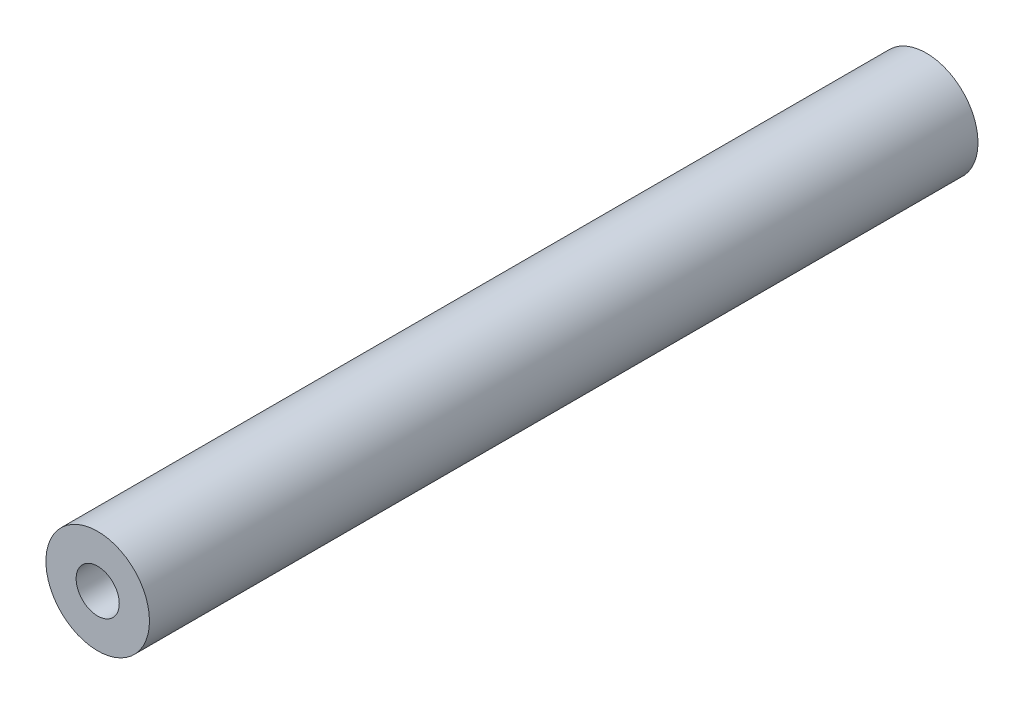
ISO-10303-21;
HEADER;
FILE_DESCRIPTION(('STEP AP214'),'2;1');
FILE_NAME('part.step','',(''),(''),'','','');
FILE_SCHEMA(('AUTOMOTIVE_DESIGN { 1 0 10303 214 1 1 1 1 }'));
ENDSEC;
DATA;
#1=APPLICATION_CONTEXT('core data for automotive mechanical design processes');
#2=APPLICATION_PROTOCOL_DEFINITION('international standard','automotive_design',2000,#1);
#3=PRODUCT_CONTEXT('',#1,'mechanical');
#4=PRODUCT('Part','Part','',(#3));
#5=PRODUCT_RELATED_PRODUCT_CATEGORY('part','',(#4));
#6=PRODUCT_DEFINITION_FORMATION('','',#4);
#7=PRODUCT_DEFINITION_CONTEXT('part definition',#1,'design');
#8=PRODUCT_DEFINITION('design','',#6,#7);
#9=PRODUCT_DEFINITION_SHAPE('','',#8);
#10=(LENGTH_UNIT() NAMED_UNIT(*) SI_UNIT(.MILLI.,.METRE.));
#11=(NAMED_UNIT(*) PLANE_ANGLE_UNIT() SI_UNIT($,.RADIAN.));
#12=(NAMED_UNIT(*) SI_UNIT($,.STERADIAN.) SOLID_ANGLE_UNIT());
#13=UNCERTAINTY_MEASURE_WITH_UNIT(LENGTH_MEASURE(1.E-05),#10,'distance_accuracy_value','');
#14=(GEOMETRIC_REPRESENTATION_CONTEXT(3) GLOBAL_UNCERTAINTY_ASSIGNED_CONTEXT((#13)) GLOBAL_UNIT_ASSIGNED_CONTEXT((#10,
#11,#12)) REPRESENTATION_CONTEXT('',''));
#15=CARTESIAN_POINT('',(0.,0.,0.));
#16=DIRECTION('',(0.,0.,1.));
#17=DIRECTION('',(1.,0.,0.));
#18=AXIS2_PLACEMENT_3D('',#15,#16,#17);
#19=CARTESIAN_POINT('',(0.,0.,24.));
#20=DIRECTION('',(0.,0.,-1.));
#21=DIRECTION('',(-1.,0.,0.));
#22=AXIS2_PLACEMENT_3D('',#19,#20,#21);
#23=CYLINDRICAL_SURFACE('',#22,3.);
#24=CARTESIAN_POINT('',(0.,0.,24.));
#25=DIRECTION('',(0.,0.,1.));
#26=DIRECTION('',(1.,0.,0.));
#27=AXIS2_PLACEMENT_3D('',#24,#25,#26);
#28=CIRCLE('',#27,3.);
#29=CARTESIAN_POINT('',(3.,0.,24.));
#30=VERTEX_POINT('',#29);
#31=EDGE_CURVE('E10',#30,#30,#28,.T.);
#32=ORIENTED_EDGE('',*,*,#31,.F.);
#33=EDGE_LOOP('',(#32));
#34=FACE_BOUND('',#33,.T.);
#35=CARTESIAN_POINT('',(0.,0.,-24.));
#36=DIRECTION('',(0.,0.,1.));
#37=DIRECTION('',(1.,0.,0.));
#38=AXIS2_PLACEMENT_3D('',#35,#36,#37);
#39=CIRCLE('',#38,3.);
#40=CARTESIAN_POINT('',(3.,0.,-24.));
#41=VERTEX_POINT('',#40);
#42=EDGE_CURVE('E50',#41,#41,#39,.T.);
#43=ORIENTED_EDGE('',*,*,#42,.T.);
#44=EDGE_LOOP('',(#43));
#45=FACE_BOUND('',#44,.T.);
#46=ADVANCED_FACE('F47',(#34,#45),#23,.T.);
#47=CARTESIAN_POINT('',(0.,0.,24.));
#48=DIRECTION('',(0.,0.,1.));
#49=DIRECTION('',(1.,0.,0.));
#50=AXIS2_PLACEMENT_3D('',#47,#48,#49);
#51=PLANE('',#50);
#52=CARTESIAN_POINT('',(0.,0.,24.));
#53=DIRECTION('',(0.,0.,1.));
#54=DIRECTION('',(1.,0.,0.));
#55=AXIS2_PLACEMENT_3D('',#52,#53,#54);
#56=CIRCLE('',#55,1.24999999999999);
#57=CARTESIAN_POINT('',(1.24999999999999,0.,24.));
#58=VERTEX_POINT('',#57);
#59=EDGE_CURVE('E59',#58,#58,#56,.T.);
#60=ORIENTED_EDGE('',*,*,#59,.F.);
#61=EDGE_LOOP('',(#60));
#62=FACE_BOUND('',#61,.T.);
#63=ORIENTED_EDGE('',*,*,#31,.T.);
#64=EDGE_LOOP('',(#63));
#65=FACE_BOUND('',#64,.T.);
#66=ADVANCED_FACE('F74',(#62,#65),#51,.T.);
#67=CARTESIAN_POINT('',(0.,0.,-24.));
#68=DIRECTION('',(0.,0.,1.));
#69=DIRECTION('',(1.,0.,0.));
#70=AXIS2_PLACEMENT_3D('',#67,#68,#69);
#71=PLANE('',#70);
#72=CARTESIAN_POINT('',(0.,0.,-24.));
#73=DIRECTION('',(0.,0.,-1.));
#74=DIRECTION('',(-1.,0.,0.));
#75=AXIS2_PLACEMENT_3D('',#72,#73,#74);
#76=CIRCLE('',#75,1.24999999999999);
#77=CARTESIAN_POINT('',(-1.24999999999999,0.,-24.));
#78=VERTEX_POINT('',#77);
#79=EDGE_CURVE('E64',#78,#78,#76,.T.);
#80=ORIENTED_EDGE('',*,*,#79,.F.);
#81=EDGE_LOOP('',(#80));
#82=FACE_BOUND('',#81,.T.);
#83=ORIENTED_EDGE('',*,*,#42,.F.);
#84=EDGE_LOOP('',(#83));
#85=FACE_BOUND('',#84,.T.);
#86=ADVANCED_FACE('F71',(#82,#85),#71,.F.);
#87=CARTESIAN_POINT('',(0.,0.,24.));
#88=DIRECTION('',(0.,0.,1.));
#89=DIRECTION('',(1.,0.,0.));
#90=AXIS2_PLACEMENT_3D('',#87,#88,#89);
#91=CYLINDRICAL_SURFACE('',#90,1.24999999999999);
#92=ORIENTED_EDGE('',*,*,#59,.T.);
#93=EDGE_LOOP('',(#92));
#94=FACE_BOUND('',#93,.T.);
#95=ORIENTED_EDGE('',*,*,#79,.T.);
#96=EDGE_LOOP('',(#95));
#97=FACE_BOUND('',#96,.T.);
#98=ADVANCED_FACE('F69',(#94,#97),#91,.F.);
#99=CLOSED_SHELL('',(#46,#66,#86,#98));
#100=MANIFOLD_SOLID_BREP('B2',#99);
#101=ADVANCED_BREP_SHAPE_REPRESENTATION('',(#18,#100),#14);
#102=SHAPE_DEFINITION_REPRESENTATION(#9,#101);
ENDSEC;
END-ISO-10303-21;
